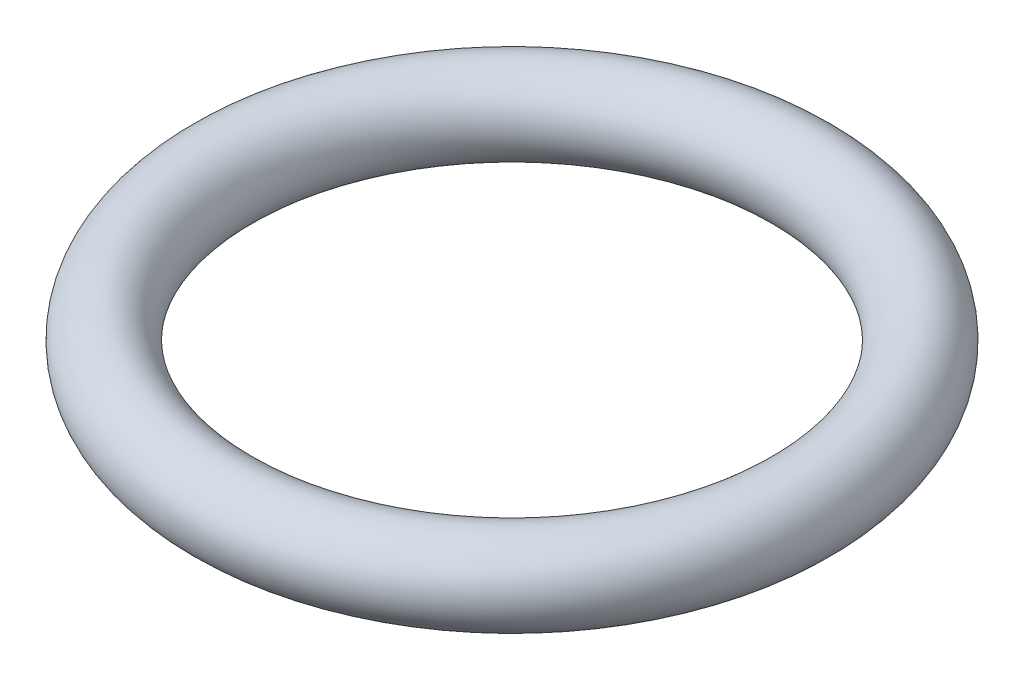
ISO-10303-21;
HEADER;
FILE_DESCRIPTION(('STEP AP214'),'2;1');
FILE_NAME('part.step','',(''),(''),'','','');
FILE_SCHEMA(('AUTOMOTIVE_DESIGN { 1 0 10303 214 1 1 1 1 }'));
ENDSEC;
DATA;
#1=APPLICATION_CONTEXT('core data for automotive mechanical design processes');
#2=APPLICATION_PROTOCOL_DEFINITION('international standard','automotive_design',2000,#1);
#3=PRODUCT_CONTEXT('',#1,'mechanical');
#4=PRODUCT('Part','Part','',(#3));
#5=PRODUCT_RELATED_PRODUCT_CATEGORY('part','',(#4));
#6=PRODUCT_DEFINITION_FORMATION('','',#4);
#7=PRODUCT_DEFINITION_CONTEXT('part definition',#1,'design');
#8=PRODUCT_DEFINITION('design','',#6,#7);
#9=PRODUCT_DEFINITION_SHAPE('','',#8);
#10=(LENGTH_UNIT() NAMED_UNIT(*) SI_UNIT(.MILLI.,.METRE.));
#11=(NAMED_UNIT(*) PLANE_ANGLE_UNIT() SI_UNIT($,.RADIAN.));
#12=(NAMED_UNIT(*) SI_UNIT($,.STERADIAN.) SOLID_ANGLE_UNIT());
#13=UNCERTAINTY_MEASURE_WITH_UNIT(LENGTH_MEASURE(1.E-05),#10,'distance_accuracy_value','');
#14=(GEOMETRIC_REPRESENTATION_CONTEXT(3) GLOBAL_UNCERTAINTY_ASSIGNED_CONTEXT((#13)) GLOBAL_UNIT_ASSIGNED_CONTEXT((#10,
#11,#12)) REPRESENTATION_CONTEXT('',''));
#15=CARTESIAN_POINT('',(0.,0.,0.));
#16=DIRECTION('',(0.,0.,1.));
#17=DIRECTION('',(1.,0.,0.));
#18=AXIS2_PLACEMENT_3D('',#15,#16,#17);
#19=CARTESIAN_POINT('',(0.,0.,0.));
#20=DIRECTION('',(0.,1.,0.));
#21=DIRECTION('',(0.,0.,1.));
#22=AXIS2_PLACEMENT_3D('',#19,#20,#21);
#23=TOROIDAL_SURFACE('',#22,5.3848,0.762);
#24=CARTESIAN_POINT('',(0.,0.,6.1468));
#25=VERTEX_POINT('',#24);
#26=VERTEX_LOOP('',#25);
#27=FACE_BOUND('',#26,.T.);
#28=ADVANCED_FACE('F32',(#27),#23,.T.);
#29=CLOSED_SHELL('',(#28));
#30=MANIFOLD_SOLID_BREP('B2',#29);
#31=ADVANCED_BREP_SHAPE_REPRESENTATION('',(#18,#30),#14);
#32=SHAPE_DEFINITION_REPRESENTATION(#9,#31);
ENDSEC;
END-ISO-10303-21;
